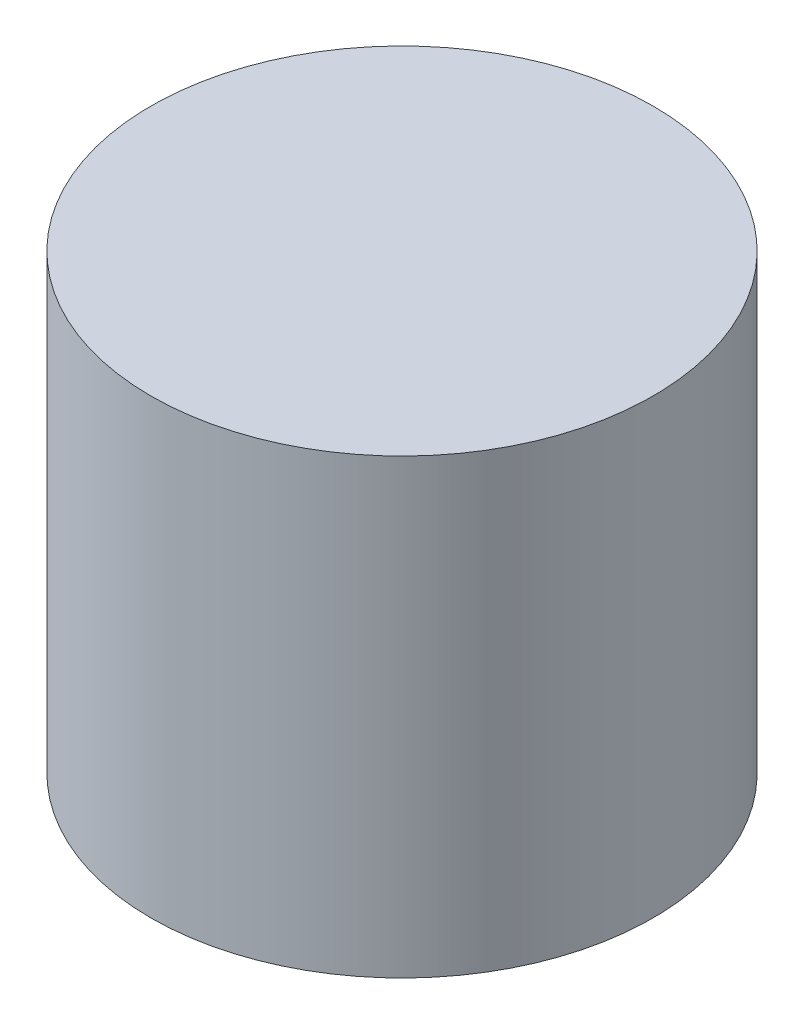
ISO-10303-21;
HEADER;
FILE_DESCRIPTION(('STEP AP214'),'2;1');
FILE_NAME('part.step','',(''),(''),'','','');
FILE_SCHEMA(('AUTOMOTIVE_DESIGN { 1 0 10303 214 1 1 1 1 }'));
ENDSEC;
DATA;
#1=APPLICATION_CONTEXT('core data for automotive mechanical design processes');
#2=APPLICATION_PROTOCOL_DEFINITION('international standard','automotive_design',2000,#1);
#3=PRODUCT_CONTEXT('',#1,'mechanical');
#4=PRODUCT('Part','Part','',(#3));
#5=PRODUCT_RELATED_PRODUCT_CATEGORY('part','',(#4));
#6=PRODUCT_DEFINITION_FORMATION('','',#4);
#7=PRODUCT_DEFINITION_CONTEXT('part definition',#1,'design');
#8=PRODUCT_DEFINITION('design','',#6,#7);
#9=PRODUCT_DEFINITION_SHAPE('','',#8);
#10=(LENGTH_UNIT() NAMED_UNIT(*) SI_UNIT(.MILLI.,.METRE.));
#11=(NAMED_UNIT(*) PLANE_ANGLE_UNIT() SI_UNIT($,.RADIAN.));
#12=(NAMED_UNIT(*) SI_UNIT($,.STERADIAN.) SOLID_ANGLE_UNIT());
#13=UNCERTAINTY_MEASURE_WITH_UNIT(LENGTH_MEASURE(1.E-05),#10,'distance_accuracy_value','');
#14=(GEOMETRIC_REPRESENTATION_CONTEXT(3) GLOBAL_UNCERTAINTY_ASSIGNED_CONTEXT((#13)) GLOBAL_UNIT_ASSIGNED_CONTEXT((#10,
#11,#12)) REPRESENTATION_CONTEXT('',''));
#15=CARTESIAN_POINT('',(0.,0.,0.));
#16=DIRECTION('',(0.,0.,1.));
#17=DIRECTION('',(1.,0.,0.));
#18=AXIS2_PLACEMENT_3D('',#15,#16,#17);
#19=CARTESIAN_POINT('',(0.,0.,0.));
#20=DIRECTION('',(0.,-1.,0.));
#21=DIRECTION('',(0.,0.,-1.));
#22=AXIS2_PLACEMENT_3D('',#19,#20,#21);
#23=PLANE('',#22);
#24=CARTESIAN_POINT('',(0.,0.,0.));
#25=DIRECTION('',(0.,-1.,0.));
#26=DIRECTION('',(0.,0.,-1.));
#27=AXIS2_PLACEMENT_3D('',#24,#25,#26);
#28=CIRCLE('',#27,20.);
#29=CARTESIAN_POINT('',(0.,0.,-20.));
#30=VERTEX_POINT('',#29);
#31=EDGE_CURVE('E10',#30,#30,#28,.T.);
#32=ORIENTED_EDGE('',*,*,#31,.T.);
#33=EDGE_LOOP('',(#32));
#34=FACE_BOUND('',#33,.T.);
#35=ADVANCED_FACE('F31',(#34),#23,.T.);
#36=CARTESIAN_POINT('',(0.,0.,0.));
#37=DIRECTION('',(0.,-1.,0.));
#38=DIRECTION('',(0.,0.,-1.));
#39=AXIS2_PLACEMENT_3D('',#36,#37,#38);
#40=CYLINDRICAL_SURFACE('',#39,20.);
#41=CARTESIAN_POINT('',(0.,36.,0.));
#42=DIRECTION('',(0.,-1.,0.));
#43=DIRECTION('',(0.,0.,-1.));
#44=AXIS2_PLACEMENT_3D('',#41,#42,#43);
#45=CIRCLE('',#44,20.);
#46=CARTESIAN_POINT('',(0.,36.,-20.));
#47=VERTEX_POINT('',#46);
#48=EDGE_CURVE('E37',#47,#47,#45,.T.);
#49=ORIENTED_EDGE('',*,*,#48,.T.);
#50=EDGE_LOOP('',(#49));
#51=FACE_BOUND('',#50,.T.);
#52=ORIENTED_EDGE('',*,*,#31,.F.);
#53=EDGE_LOOP('',(#52));
#54=FACE_BOUND('',#53,.T.);
#55=ADVANCED_FACE('F43',(#51,#54),#40,.T.);
#56=CARTESIAN_POINT('',(20.,36.,0.));
#57=DIRECTION('',(0.,1.,0.));
#58=DIRECTION('',(0.,0.,1.));
#59=AXIS2_PLACEMENT_3D('',#56,#57,#58);
#60=PLANE('',#59);
#61=ORIENTED_EDGE('',*,*,#48,.F.);
#62=EDGE_LOOP('',(#61));
#63=FACE_BOUND('',#62,.T.);
#64=ADVANCED_FACE('F46',(#63),#60,.T.);
#65=CLOSED_SHELL('',(#35,#55,#64));
#66=MANIFOLD_SOLID_BREP('B2',#65);
#67=ADVANCED_BREP_SHAPE_REPRESENTATION('',(#18,#66),#14);
#68=SHAPE_DEFINITION_REPRESENTATION(#9,#67);
ENDSEC;
END-ISO-10303-21;
